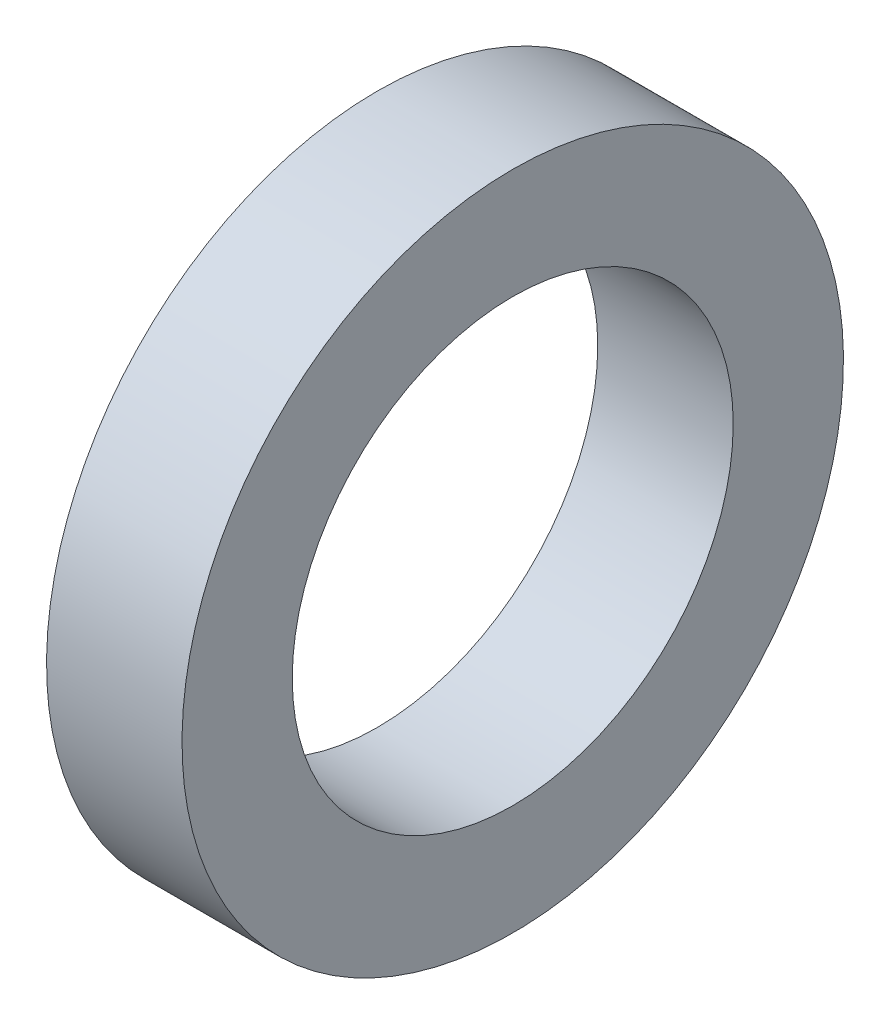
ISO-10303-21;
HEADER;
FILE_DESCRIPTION(('STEP AP214'),'2;1');
FILE_NAME('part.step','',(''),(''),'','','');
FILE_SCHEMA(('AUTOMOTIVE_DESIGN { 1 0 10303 214 1 1 1 1 }'));
ENDSEC;
DATA;
#1=APPLICATION_CONTEXT('core data for automotive mechanical design processes');
#2=APPLICATION_PROTOCOL_DEFINITION('international standard','automotive_design',2000,#1);
#3=PRODUCT_CONTEXT('',#1,'mechanical');
#4=PRODUCT('Part','Part','',(#3));
#5=PRODUCT_RELATED_PRODUCT_CATEGORY('part','',(#4));
#6=PRODUCT_DEFINITION_FORMATION('','',#4);
#7=PRODUCT_DEFINITION_CONTEXT('part definition',#1,'design');
#8=PRODUCT_DEFINITION('design','',#6,#7);
#9=PRODUCT_DEFINITION_SHAPE('','',#8);
#10=(LENGTH_UNIT() NAMED_UNIT(*) SI_UNIT(.MILLI.,.METRE.));
#11=(NAMED_UNIT(*) PLANE_ANGLE_UNIT() SI_UNIT($,.RADIAN.));
#12=(NAMED_UNIT(*) SI_UNIT($,.STERADIAN.) SOLID_ANGLE_UNIT());
#13=UNCERTAINTY_MEASURE_WITH_UNIT(LENGTH_MEASURE(1.E-05),#10,'distance_accuracy_value','');
#14=(GEOMETRIC_REPRESENTATION_CONTEXT(3) GLOBAL_UNCERTAINTY_ASSIGNED_CONTEXT((#13)) GLOBAL_UNIT_ASSIGNED_CONTEXT((#10,
#11,#12)) REPRESENTATION_CONTEXT('',''));
#15=CARTESIAN_POINT('',(0.,0.,0.));
#16=DIRECTION('',(0.,0.,1.));
#17=DIRECTION('',(1.,0.,0.));
#18=AXIS2_PLACEMENT_3D('',#15,#16,#17);
#19=CARTESIAN_POINT('',(3.90144,0.,0.));
#20=DIRECTION('',(1.,0.,0.));
#21=DIRECTION('',(0.,1.,0.));
#22=AXIS2_PLACEMENT_3D('',#19,#20,#21);
#23=CYLINDRICAL_SURFACE('',#22,6.35);
#24=CARTESIAN_POINT('',(0.,0.,0.));
#25=DIRECTION('',(1.,0.,0.));
#26=DIRECTION('',(0.,1.,0.));
#27=AXIS2_PLACEMENT_3D('',#24,#25,#26);
#28=CIRCLE('',#27,6.35);
#29=CARTESIAN_POINT('',(0.,6.35,0.));
#30=VERTEX_POINT('',#29);
#31=EDGE_CURVE('E51',#30,#30,#28,.T.);
#32=ORIENTED_EDGE('',*,*,#31,.F.);
#33=EDGE_LOOP('',(#32));
#34=FACE_BOUND('',#33,.T.);
#35=CARTESIAN_POINT('',(3.90143999999999,0.,0.));
#36=DIRECTION('',(1.,0.,0.));
#37=DIRECTION('',(0.,1.,0.));
#38=AXIS2_PLACEMENT_3D('',#35,#36,#37);
#39=CIRCLE('',#38,6.35);
#40=CARTESIAN_POINT('',(3.90144,6.35,0.));
#41=VERTEX_POINT('',#40);
#42=EDGE_CURVE('E10',#41,#41,#39,.T.);
#43=ORIENTED_EDGE('',*,*,#42,.T.);
#44=EDGE_LOOP('',(#43));
#45=FACE_BOUND('',#44,.T.);
#46=ADVANCED_FACE('F37',(#34,#45),#23,.F.);
#47=CARTESIAN_POINT('',(3.90143999999999,0.,0.));
#48=DIRECTION('',(-1.,0.,0.));
#49=DIRECTION('',(0.,-1.,0.));
#50=AXIS2_PLACEMENT_3D('',#47,#48,#49);
#51=PLANE('',#50);
#52=ORIENTED_EDGE('',*,*,#42,.F.);
#53=EDGE_LOOP('',(#52));
#54=FACE_BOUND('',#53,.T.);
#55=CARTESIAN_POINT('',(3.90143999999999,0.,0.));
#56=DIRECTION('',(1.,0.,0.));
#57=DIRECTION('',(0.,1.,0.));
#58=AXIS2_PLACEMENT_3D('',#55,#56,#57);
#59=CIRCLE('',#58,9.525);
#60=CARTESIAN_POINT('',(3.90144,9.525,0.));
#61=VERTEX_POINT('',#60);
#62=EDGE_CURVE('E43',#61,#61,#59,.T.);
#63=ORIENTED_EDGE('',*,*,#62,.T.);
#64=EDGE_LOOP('',(#63));
#65=FACE_BOUND('',#64,.T.);
#66=ADVANCED_FACE('F60',(#54,#65),#51,.F.);
#67=CARTESIAN_POINT('',(3.90144,0.,0.));
#68=DIRECTION('',(1.,0.,0.));
#69=DIRECTION('',(0.,1.,0.));
#70=AXIS2_PLACEMENT_3D('',#67,#68,#69);
#71=CYLINDRICAL_SURFACE('',#70,9.525);
#72=ORIENTED_EDGE('',*,*,#62,.F.);
#73=EDGE_LOOP('',(#72));
#74=FACE_BOUND('',#73,.T.);
#75=CARTESIAN_POINT('',(0.,0.,0.));
#76=DIRECTION('',(1.,0.,0.));
#77=DIRECTION('',(0.,1.,0.));
#78=AXIS2_PLACEMENT_3D('',#75,#76,#77);
#79=CIRCLE('',#78,9.525);
#80=CARTESIAN_POINT('',(0.,9.525,0.));
#81=VERTEX_POINT('',#80);
#82=EDGE_CURVE('E47',#81,#81,#79,.T.);
#83=ORIENTED_EDGE('',*,*,#82,.T.);
#84=EDGE_LOOP('',(#83));
#85=FACE_BOUND('',#84,.T.);
#86=ADVANCED_FACE('F64',(#74,#85),#71,.T.);
#87=CARTESIAN_POINT('',(0.,0.,0.));
#88=DIRECTION('',(1.,0.,0.));
#89=DIRECTION('',(0.,1.,0.));
#90=AXIS2_PLACEMENT_3D('',#87,#88,#89);
#91=PLANE('',#90);
#92=ORIENTED_EDGE('',*,*,#82,.F.);
#93=EDGE_LOOP('',(#92));
#94=FACE_BOUND('',#93,.T.);
#95=ORIENTED_EDGE('',*,*,#31,.T.);
#96=EDGE_LOOP('',(#95));
#97=FACE_BOUND('',#96,.T.);
#98=ADVANCED_FACE('F57',(#94,#97),#91,.F.);
#99=CLOSED_SHELL('',(#46,#66,#86,#98));
#100=MANIFOLD_SOLID_BREP('B2',#99);
#101=ADVANCED_BREP_SHAPE_REPRESENTATION('',(#18,#100),#14);
#102=SHAPE_DEFINITION_REPRESENTATION(#9,#101);
ENDSEC;
END-ISO-10303-21;
